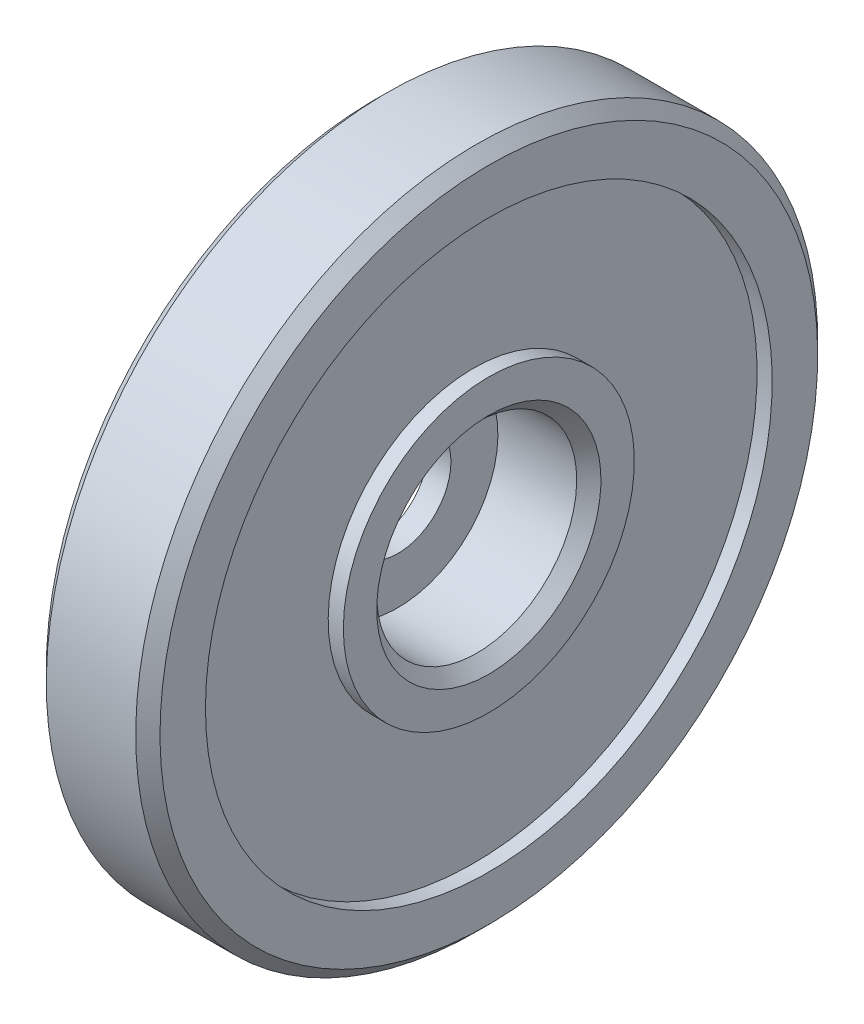
ISO-10303-21;
HEADER;
FILE_DESCRIPTION(('STEP AP214'),'2;1');
FILE_NAME('part.step','',(''),(''),'','','');
FILE_SCHEMA(('AUTOMOTIVE_DESIGN { 1 0 10303 214 1 1 1 1 }'));
ENDSEC;
DATA;
#1=APPLICATION_CONTEXT('core data for automotive mechanical design processes');
#2=APPLICATION_PROTOCOL_DEFINITION('international standard','automotive_design',2000,#1);
#3=PRODUCT_CONTEXT('',#1,'mechanical');
#4=PRODUCT('Part','Part','',(#3));
#5=PRODUCT_RELATED_PRODUCT_CATEGORY('part','',(#4));
#6=PRODUCT_DEFINITION_FORMATION('','',#4);
#7=PRODUCT_DEFINITION_CONTEXT('part definition',#1,'design');
#8=PRODUCT_DEFINITION('design','',#6,#7);
#9=PRODUCT_DEFINITION_SHAPE('','',#8);
#10=(LENGTH_UNIT() NAMED_UNIT(*) SI_UNIT(.MILLI.,.METRE.));
#11=(NAMED_UNIT(*) PLANE_ANGLE_UNIT() SI_UNIT($,.RADIAN.));
#12=(NAMED_UNIT(*) SI_UNIT($,.STERADIAN.) SOLID_ANGLE_UNIT());
#13=UNCERTAINTY_MEASURE_WITH_UNIT(LENGTH_MEASURE(1.E-05),#10,'distance_accuracy_value','');
#14=(GEOMETRIC_REPRESENTATION_CONTEXT(3) GLOBAL_UNCERTAINTY_ASSIGNED_CONTEXT((#13)) GLOBAL_UNIT_ASSIGNED_CONTEXT((#10,
#11,#12)) REPRESENTATION_CONTEXT('',''));
#15=CARTESIAN_POINT('',(0.,0.,0.));
#16=DIRECTION('',(0.,0.,1.));
#17=DIRECTION('',(1.,0.,0.));
#18=AXIS2_PLACEMENT_3D('',#15,#16,#17);
#19=CARTESIAN_POINT('',(120.899999999998,-26.570156009208,-29.4506874007701));
#20=DIRECTION('',(1.,0.,0.));
#21=DIRECTION('',(0.,0.999903298534947,0.013906601990886));
#22=AXIS2_PLACEMENT_3D('',#19,#20,#21);
#23=CONICAL_SURFACE('',#22,6.6,0.785398163397449);
#24=CARTESIAN_POINT('',(120.899999999998,-26.570156009208,-29.4506874007701));
#25=DIRECTION('',(1.,0.,0.));
#26=DIRECTION('',(0.,0.999903298534947,0.013906601990886));
#27=AXIS2_PLACEMENT_3D('',#24,#25,#26);
#28=CIRCLE('',#27,6.6);
#29=CARTESIAN_POINT('',(120.899999999998,-19.9707942388773,-29.3589038276302));
#30=VERTEX_POINT('',#29);
#31=EDGE_CURVE('E162',#30,#30,#28,.T.);
#32=ORIENTED_EDGE('',*,*,#31,.F.);
#33=EDGE_LOOP('',(#32));
#34=FACE_BOUND('',#33,.T.);
#35=CARTESIAN_POINT('',(121.699999999998,-26.570156009208,-29.4506874007701));
#36=DIRECTION('',(-1.,0.,0.));
#37=DIRECTION('',(0.,0.999903298534947,0.013906601990886));
#38=AXIS2_PLACEMENT_3D('',#35,#36,#37);
#39=CIRCLE('',#38,7.4);
#40=CARTESIAN_POINT('',(121.699999999998,-19.1708716000494,-29.3477785460375));
#41=VERTEX_POINT('',#40);
#42=EDGE_CURVE('E152',#41,#41,#39,.T.);
#43=ORIENTED_EDGE('',*,*,#42,.F.);
#44=EDGE_LOOP('',(#43));
#45=FACE_BOUND('',#44,.T.);
#46=ADVANCED_FACE('F53',(#34,#45),#23,.F.);
#47=CARTESIAN_POINT('',(118.399999999998,-26.570156009208,-29.4506874007701));
#48=DIRECTION('',(-1.,0.,0.));
#49=DIRECTION('',(0.,0.999903298534947,0.013906601990886));
#50=AXIS2_PLACEMENT_3D('',#47,#48,#49);
#51=PLANE('',#50);
#52=CARTESIAN_POINT('',(118.399999999998,-26.7092220291169,-19.4516544154206));
#53=DIRECTION('',(-1.,0.,0.));
#54=DIRECTION('',(0.,-0.999903298534947,-0.013906601990886));
#55=AXIS2_PLACEMENT_3D('',#52,#53,#54);
#56=CIRCLE('',#55,1.15);
#57=CARTESIAN_POINT('',(118.399999999998,-27.8591108224321,-19.4676470077101));
#58=VERTEX_POINT('',#57);
#59=EDGE_CURVE('E11',#58,#58,#56,.T.);
#60=ORIENTED_EDGE('',*,*,#59,.T.);
#61=EDGE_LOOP('',(#60));
#62=FACE_BOUND('',#61,.T.);
#63=ADVANCED_FACE('F55',(#62),#51,.T.);
#64=CARTESIAN_POINT('',(118.399999999998,-26.7092220291169,-19.4516544154206));
#65=DIRECTION('',(-1.,0.,0.));
#66=DIRECTION('',(0.,-0.999903298534947,-0.013906601990886));
#67=AXIS2_PLACEMENT_3D('',#64,#65,#66);
#68=CYLINDRICAL_SURFACE('',#67,1.15);
#69=CARTESIAN_POINT('',(114.199999999998,-26.7092220291169,-19.4516544154206));
#70=DIRECTION('',(1.,0.,0.));
#71=DIRECTION('',(0.,0.999903298534947,0.013906601990886));
#72=AXIS2_PLACEMENT_3D('',#69,#70,#71);
#73=CIRCLE('',#72,1.15);
#74=CARTESIAN_POINT('',(114.199999999998,-25.5593332358017,-19.4356618231311));
#75=VERTEX_POINT('',#74);
#76=EDGE_CURVE('E173',#75,#75,#73,.T.);
#77=ORIENTED_EDGE('',*,*,#76,.F.);
#78=EDGE_LOOP('',(#77));
#79=FACE_BOUND('',#78,.T.);
#80=ORIENTED_EDGE('',*,*,#59,.F.);
#81=EDGE_LOOP('',(#80));
#82=FACE_BOUND('',#81,.T.);
#83=ADVANCED_FACE('F239',(#79,#82),#68,.F.);
#84=CARTESIAN_POINT('',(118.399999999998,-26.570156009208,-29.4506874007701));
#85=DIRECTION('',(-1.,0.,0.));
#86=DIRECTION('',(0.,0.999903298534947,0.013906601990886));
#87=AXIS2_PLACEMENT_3D('',#84,#85,#86);
#88=PLANE('',#87);
#89=CARTESIAN_POINT('',(118.399999999998,-17.8412064206624,-34.3297691874005));
#90=DIRECTION('',(-1.,0.,0.));
#91=DIRECTION('',(0.,-0.999903298534947,-0.013906601990886));
#92=AXIS2_PLACEMENT_3D('',#89,#90,#91);
#93=CIRCLE('',#92,1.15);
#94=CARTESIAN_POINT('',(118.399999999998,-18.9910952139776,-34.3457617796901));
#95=VERTEX_POINT('',#94);
#96=EDGE_CURVE('E62',#95,#95,#93,.T.);
#97=ORIENTED_EDGE('',*,*,#96,.T.);
#98=EDGE_LOOP('',(#97));
#99=FACE_BOUND('',#98,.T.);
#100=ADVANCED_FACE('F234',(#99),#88,.T.);
#101=CARTESIAN_POINT('',(118.399999999998,-17.8412064206624,-34.3297691874005));
#102=DIRECTION('',(-1.,0.,0.));
#103=DIRECTION('',(0.,-0.999903298534947,-0.013906601990886));
#104=AXIS2_PLACEMENT_3D('',#101,#102,#103);
#105=CYLINDRICAL_SURFACE('',#104,1.15);
#106=CARTESIAN_POINT('',(114.199999999998,-17.8412064206624,-34.3297691874005));
#107=DIRECTION('',(1.,0.,0.));
#108=DIRECTION('',(0.,0.999903298534947,0.013906601990886));
#109=AXIS2_PLACEMENT_3D('',#106,#107,#108);
#110=CIRCLE('',#109,1.15);
#111=CARTESIAN_POINT('',(114.199999999998,-16.6913176273472,-34.313776595111));
#112=VERTEX_POINT('',#111);
#113=EDGE_CURVE('E176',#112,#112,#110,.T.);
#114=ORIENTED_EDGE('',*,*,#113,.F.);
#115=EDGE_LOOP('',(#114));
#116=FACE_BOUND('',#115,.T.);
#117=ORIENTED_EDGE('',*,*,#96,.F.);
#118=EDGE_LOOP('',(#117));
#119=FACE_BOUND('',#118,.T.);
#120=ADVANCED_FACE('F238',(#116,#119),#105,.F.);
#121=CARTESIAN_POINT('',(118.399999999998,-26.570156009208,-29.4506874007701));
#122=DIRECTION('',(-1.,0.,0.));
#123=DIRECTION('',(0.,0.999903298534947,0.013906601990886));
#124=AXIS2_PLACEMENT_3D('',#121,#122,#123);
#125=PLANE('',#124);
#126=CARTESIAN_POINT('',(118.399999999998,-35.1600395778448,-34.5706385994891));
#127=DIRECTION('',(-1.,0.,0.));
#128=DIRECTION('',(0.,-0.999903298534947,-0.013906601990886));
#129=AXIS2_PLACEMENT_3D('',#126,#127,#128);
#130=CIRCLE('',#129,1.15);
#131=CARTESIAN_POINT('',(118.399999999998,-36.30992837116,-34.5866311917786));
#132=VERTEX_POINT('',#131);
#133=EDGE_CURVE('E166',#132,#132,#130,.T.);
#134=ORIENTED_EDGE('',*,*,#133,.T.);
#135=EDGE_LOOP('',(#134));
#136=FACE_BOUND('',#135,.T.);
#137=ADVANCED_FACE('F334',(#136),#125,.T.);
#138=CARTESIAN_POINT('',(118.399999999998,-35.1600395778448,-34.5706385994891));
#139=DIRECTION('',(-1.,0.,0.));
#140=DIRECTION('',(0.,-0.999903298534947,-0.013906601990886));
#141=AXIS2_PLACEMENT_3D('',#138,#139,#140);
#142=CYLINDRICAL_SURFACE('',#141,1.15);
#143=CARTESIAN_POINT('',(114.199999999998,-35.1600395778448,-34.5706385994891));
#144=DIRECTION('',(1.,0.,0.));
#145=DIRECTION('',(0.,0.999903298534947,0.013906601990886));
#146=AXIS2_PLACEMENT_3D('',#143,#144,#145);
#147=CIRCLE('',#146,1.15);
#148=CARTESIAN_POINT('',(114.199999999998,-34.0101507845296,-34.5546460071995));
#149=VERTEX_POINT('',#148);
#150=EDGE_CURVE('E183',#149,#149,#147,.T.);
#151=ORIENTED_EDGE('',*,*,#150,.F.);
#152=EDGE_LOOP('',(#151));
#153=FACE_BOUND('',#152,.T.);
#154=ORIENTED_EDGE('',*,*,#133,.F.);
#155=EDGE_LOOP('',(#154));
#156=FACE_BOUND('',#155,.T.);
#157=ADVANCED_FACE('F325',(#153,#156),#142,.F.);
#158=CARTESIAN_POINT('',(120.699999999998,-26.570156009208,-29.4506874007701));
#159=DIRECTION('',(1.,0.,0.));
#160=DIRECTION('',(0.,-0.013906601990886,0.999903298534947));
#161=AXIS2_PLACEMENT_3D('',#158,#159,#160);
#162=PLANE('',#161);
#163=CARTESIAN_POINT('',(120.699999999998,-26.570156009208,-29.4506874007701));
#164=DIRECTION('',(1.,0.,0.));
#165=DIRECTION('',(0.,0.999903298534947,0.013906601990886));
#166=AXIS2_PLACEMENT_3D('',#163,#164,#165);
#167=CIRCLE('',#166,18.7);
#168=CARTESIAN_POINT('',(120.699999999998,-7.87196432660449,-29.1906339435405));
#169=VERTEX_POINT('',#168);
#170=EDGE_CURVE('E168',#169,#169,#167,.T.);
#171=ORIENTED_EDGE('',*,*,#170,.T.);
#172=EDGE_LOOP('',(#171));
#173=FACE_BOUND('',#172,.T.);
#174=CARTESIAN_POINT('',(120.699999999998,-26.570156009208,-29.4506874007701));
#175=DIRECTION('',(1.,0.,0.));
#176=DIRECTION('',(0.,0.999903298534947,0.013906601990886));
#177=AXIS2_PLACEMENT_3D('',#174,#175,#176);
#178=CIRCLE('',#177,9.6);
#179=CARTESIAN_POINT('',(120.699999999998,-16.9710843432725,-29.3171840216576));
#180=VERTEX_POINT('',#179);
#181=EDGE_CURVE('E197',#180,#180,#178,.T.);
#182=ORIENTED_EDGE('',*,*,#181,.F.);
#183=EDGE_LOOP('',(#182));
#184=FACE_BOUND('',#183,.T.);
#185=ADVANCED_FACE('F316',(#173,#184),#162,.T.);
#186=CARTESIAN_POINT('',(120.699999999998,-26.570156009208,-29.4506874007701));
#187=DIRECTION('',(1.,0.,0.));
#188=DIRECTION('',(0.,0.999903298534947,0.013906601990886));
#189=AXIS2_PLACEMENT_3D('',#186,#187,#188);
#190=CYLINDRICAL_SURFACE('',#189,18.7);
#191=CARTESIAN_POINT('',(121.699999999998,-26.570156009208,-29.4506874007701));
#192=DIRECTION('',(1.,0.,0.));
#193=DIRECTION('',(0.,0.999903298534947,0.013906601990886));
#194=AXIS2_PLACEMENT_3D('',#191,#192,#193);
#195=CIRCLE('',#194,18.7);
#196=CARTESIAN_POINT('',(121.699999999998,-7.87196432660449,-29.1906339435405));
#197=VERTEX_POINT('',#196);
#198=EDGE_CURVE('E186',#197,#197,#195,.T.);
#199=ORIENTED_EDGE('',*,*,#198,.T.);
#200=EDGE_LOOP('',(#199));
#201=FACE_BOUND('',#200,.T.);
#202=ORIENTED_EDGE('',*,*,#170,.F.);
#203=EDGE_LOOP('',(#202));
#204=FACE_BOUND('',#203,.T.);
#205=ADVANCED_FACE('F220',(#201,#204),#190,.F.);
#206=CARTESIAN_POINT('',(120.699999999998,-26.570156009208,-29.4506874007701));
#207=DIRECTION('',(1.,0.,0.));
#208=DIRECTION('',(0.,0.999903298534947,0.013906601990886));
#209=AXIS2_PLACEMENT_3D('',#206,#207,#208);
#210=CYLINDRICAL_SURFACE('',#209,9.6);
#211=CARTESIAN_POINT('',(121.699999999998,-26.570156009208,-29.4506874007701));
#212=DIRECTION('',(1.,0.,0.));
#213=DIRECTION('',(0.,0.999903298534947,0.013906601990886));
#214=AXIS2_PLACEMENT_3D('',#211,#212,#213);
#215=CIRCLE('',#214,9.6);
#216=CARTESIAN_POINT('',(121.699999999998,-16.9710843432725,-29.3171840216576));
#217=VERTEX_POINT('',#216);
#218=EDGE_CURVE('E146',#217,#217,#215,.T.);
#219=ORIENTED_EDGE('',*,*,#218,.F.);
#220=EDGE_LOOP('',(#219));
#221=FACE_BOUND('',#220,.T.);
#222=ORIENTED_EDGE('',*,*,#181,.T.);
#223=EDGE_LOOP('',(#222));
#224=FACE_BOUND('',#223,.T.);
#225=ADVANCED_FACE('F215',(#221,#224),#210,.T.);
#226=CARTESIAN_POINT('',(114.999999999998,-26.570156009208,-29.4506874007701));
#227=DIRECTION('',(1.,0.,0.));
#228=DIRECTION('',(0.,0.999903298534947,0.013906601990886));
#229=AXIS2_PLACEMENT_3D('',#226,#227,#228);
#230=CONICAL_SURFACE('',#229,22.5,0.785398163397448);
#231=CARTESIAN_POINT('',(114.999999999998,-26.570156009208,-29.4506874007701));
#232=DIRECTION('',(1.,0.,0.));
#233=DIRECTION('',(0.,0.999903298534947,0.013906601990886));
#234=AXIS2_PLACEMENT_3D('',#231,#232,#233);
#235=CIRCLE('',#234,22.5);
#236=CARTESIAN_POINT('',(114.999999999998,-4.07233179217169,-29.1377888559751));
#237=VERTEX_POINT('',#236);
#238=EDGE_CURVE('E180',#237,#237,#235,.T.);
#239=ORIENTED_EDGE('',*,*,#238,.F.);
#240=EDGE_LOOP('',(#239));
#241=FACE_BOUND('',#240,.T.);
#242=CARTESIAN_POINT('',(114.199999999998,-26.570156009208,-29.4506874007701));
#243=DIRECTION('',(-1.,0.,0.));
#244=DIRECTION('',(0.,0.999903298534947,0.013906601990886));
#245=AXIS2_PLACEMENT_3D('',#242,#243,#244);
#246=CIRCLE('',#245,21.7);
#247=CARTESIAN_POINT('',(114.199999999998,-4.87225443099965,-29.1489141375678));
#248=VERTEX_POINT('',#247);
#249=EDGE_CURVE('E164',#248,#248,#246,.T.);
#250=ORIENTED_EDGE('',*,*,#249,.F.);
#251=EDGE_LOOP('',(#250));
#252=FACE_BOUND('',#251,.T.);
#253=ADVANCED_FACE('F219',(#241,#252),#230,.T.);
#254=CARTESIAN_POINT('',(121.699999999998,-26.570156009208,-29.4506874007701));
#255=DIRECTION('',(-1.,0.,0.));
#256=DIRECTION('',(0.,-0.999903298534947,-0.013906601990886));
#257=AXIS2_PLACEMENT_3D('',#254,#255,#256);
#258=CONICAL_SURFACE('',#257,21.7,0.785398163397448);
#259=CARTESIAN_POINT('',(121.699999999998,-26.570156009208,-29.4506874007701));
#260=DIRECTION('',(1.,0.,0.));
#261=DIRECTION('',(0.,0.999903298534947,0.013906601990886));
#262=AXIS2_PLACEMENT_3D('',#259,#260,#261);
#263=CIRCLE('',#262,21.7);
#264=CARTESIAN_POINT('',(121.699999999998,-4.87225443099965,-29.1489141375678));
#265=VERTEX_POINT('',#264);
#266=EDGE_CURVE('E177',#265,#265,#263,.T.);
#267=ORIENTED_EDGE('',*,*,#266,.F.);
#268=EDGE_LOOP('',(#267));
#269=FACE_BOUND('',#268,.T.);
#270=CARTESIAN_POINT('',(120.899999999998,-26.570156009208,-29.4506874007701));
#271=DIRECTION('',(-1.,0.,0.));
#272=DIRECTION('',(0.,0.999903298534947,0.013906601990886));
#273=AXIS2_PLACEMENT_3D('',#270,#271,#272);
#274=CIRCLE('',#273,22.5);
#275=CARTESIAN_POINT('',(120.899999999998,-4.07233179217169,-29.1377888559751));
#276=VERTEX_POINT('',#275);
#277=EDGE_CURVE('E172',#276,#276,#274,.T.);
#278=ORIENTED_EDGE('',*,*,#277,.F.);
#279=EDGE_LOOP('',(#278));
#280=FACE_BOUND('',#279,.T.);
#281=ADVANCED_FACE('F283',(#269,#280),#258,.T.);
#282=CARTESIAN_POINT('',(115.699999999998,-26.570156009208,-29.4506874007701));
#283=DIRECTION('',(1.,0.,0.));
#284=DIRECTION('',(0.,-0.013906601990886,0.999903298534947));
#285=AXIS2_PLACEMENT_3D('',#282,#283,#284);
#286=PLANE('',#285);
#287=CARTESIAN_POINT('',(115.699999999998,-26.570156009208,-29.4506874007701));
#288=DIRECTION('',(1.,0.,0.));
#289=DIRECTION('',(0.,0.999903298534947,0.013906601990886));
#290=AXIS2_PLACEMENT_3D('',#287,#288,#289);
#291=CIRCLE('',#290,6.6);
#292=CARTESIAN_POINT('',(115.699999999998,-19.9707942388773,-29.3589038276302));
#293=VERTEX_POINT('',#292);
#294=EDGE_CURVE('E163',#293,#293,#291,.T.);
#295=ORIENTED_EDGE('',*,*,#294,.T.);
#296=EDGE_LOOP('',(#295));
#297=FACE_BOUND('',#296,.T.);
#298=CARTESIAN_POINT('',(115.699999999998,-26.570156009208,-29.4506874007701));
#299=DIRECTION('',(1.,0.,0.));
#300=DIRECTION('',(0.,0.999903298534947,0.013906601990886));
#301=AXIS2_PLACEMENT_3D('',#298,#299,#300);
#302=CIRCLE('',#301,3.5);
#303=CARTESIAN_POINT('',(115.699999999998,-23.0704944643357,-29.402014293802));
#304=VERTEX_POINT('',#303);
#305=EDGE_CURVE('E157',#304,#304,#302,.T.);
#306=ORIENTED_EDGE('',*,*,#305,.F.);
#307=EDGE_LOOP('',(#306));
#308=FACE_BOUND('',#307,.T.);
#309=ADVANCED_FACE('F249',(#297,#308),#286,.T.);
#310=CARTESIAN_POINT('',(115.699999999998,-26.570156009208,-29.4506874007701));
#311=DIRECTION('',(1.,0.,0.));
#312=DIRECTION('',(0.,0.999903298534947,0.013906601990886));
#313=AXIS2_PLACEMENT_3D('',#310,#311,#312);
#314=CYLINDRICAL_SURFACE('',#313,6.6);
#315=ORIENTED_EDGE('',*,*,#294,.F.);
#316=EDGE_LOOP('',(#315));
#317=FACE_BOUND('',#316,.T.);
#318=ORIENTED_EDGE('',*,*,#31,.T.);
#319=EDGE_LOOP('',(#318));
#320=FACE_BOUND('',#319,.T.);
#321=ADVANCED_FACE('F244',(#317,#320),#314,.F.);
#322=CARTESIAN_POINT('',(114.199999999998,-26.570156009208,-29.4506874007701));
#323=DIRECTION('',(1.,0.,0.));
#324=DIRECTION('',(0.,-0.013906601990886,0.999903298534947));
#325=AXIS2_PLACEMENT_3D('',#322,#323,#324);
#326=PLANE('',#325);
#327=CARTESIAN_POINT('',(114.199999999998,-26.570156009208,-29.4506874007701));
#328=DIRECTION('',(1.,0.,0.));
#329=DIRECTION('',(0.,0.999903298534947,0.013906601990886));
#330=AXIS2_PLACEMENT_3D('',#327,#328,#329);
#331=CIRCLE('',#330,3.5);
#332=CARTESIAN_POINT('',(114.199999999998,-23.0704944643357,-29.4020142938019));
#333=VERTEX_POINT('',#332);
#334=EDGE_CURVE('E151',#333,#333,#331,.T.);
#335=ORIENTED_EDGE('',*,*,#334,.T.);
#336=EDGE_LOOP('',(#335));
#337=FACE_BOUND('',#336,.T.);
#338=ORIENTED_EDGE('',*,*,#249,.T.);
#339=EDGE_LOOP('',(#338));
#340=FACE_BOUND('',#339,.T.);
#341=ORIENTED_EDGE('',*,*,#150,.T.);
#342=EDGE_LOOP('',(#341));
#343=FACE_BOUND('',#342,.T.);
#344=ORIENTED_EDGE('',*,*,#113,.T.);
#345=EDGE_LOOP('',(#344));
#346=FACE_BOUND('',#345,.T.);
#347=ORIENTED_EDGE('',*,*,#76,.T.);
#348=EDGE_LOOP('',(#347));
#349=FACE_BOUND('',#348,.T.);
#350=ADVANCED_FACE('F248',(#337,#340,#343,#346,#349),#326,.F.);
#351=CARTESIAN_POINT('',(121.699999999998,-26.570156009208,-29.4506874007701));
#352=DIRECTION('',(1.,0.,0.));
#353=DIRECTION('',(0.,-0.013906601990886,0.999903298534947));
#354=AXIS2_PLACEMENT_3D('',#351,#352,#353);
#355=PLANE('',#354);
#356=ORIENTED_EDGE('',*,*,#266,.T.);
#357=EDGE_LOOP('',(#356));
#358=FACE_BOUND('',#357,.T.);
#359=ORIENTED_EDGE('',*,*,#198,.F.);
#360=EDGE_LOOP('',(#359));
#361=FACE_BOUND('',#360,.T.);
#362=ADVANCED_FACE('F258',(#358,#361),#355,.T.);
#363=CARTESIAN_POINT('',(121.699999999998,-26.570156009208,-29.4506874007701));
#364=DIRECTION('',(-1.,0.,0.));
#365=DIRECTION('',(0.,-0.999903298534947,-0.013906601990886));
#366=AXIS2_PLACEMENT_3D('',#363,#364,#365);
#367=CYLINDRICAL_SURFACE('',#366,22.5);
#368=ORIENTED_EDGE('',*,*,#238,.T.);
#369=EDGE_LOOP('',(#368));
#370=FACE_BOUND('',#369,.T.);
#371=ORIENTED_EDGE('',*,*,#277,.T.);
#372=EDGE_LOOP('',(#371));
#373=FACE_BOUND('',#372,.T.);
#374=ADVANCED_FACE('F228',(#370,#373),#367,.T.);
#375=CARTESIAN_POINT('',(121.699999999998,-26.570156009208,-29.4506874007701));
#376=DIRECTION('',(-1.,0.,0.));
#377=DIRECTION('',(0.,-0.999903298534947,-0.013906601990886));
#378=AXIS2_PLACEMENT_3D('',#375,#376,#377);
#379=CYLINDRICAL_SURFACE('',#378,3.5);
#380=ORIENTED_EDGE('',*,*,#305,.T.);
#381=EDGE_LOOP('',(#380));
#382=FACE_BOUND('',#381,.T.);
#383=ORIENTED_EDGE('',*,*,#334,.F.);
#384=EDGE_LOOP('',(#383));
#385=FACE_BOUND('',#384,.T.);
#386=ADVANCED_FACE('F210',(#382,#385),#379,.F.);
#387=CARTESIAN_POINT('',(121.699999999998,-26.570156009208,-29.4506874007701));
#388=DIRECTION('',(1.,0.,0.));
#389=DIRECTION('',(0.,-0.013906601990886,0.999903298534947));
#390=AXIS2_PLACEMENT_3D('',#387,#388,#389);
#391=PLANE('',#390);
#392=ORIENTED_EDGE('',*,*,#218,.T.);
#393=EDGE_LOOP('',(#392));
#394=FACE_BOUND('',#393,.T.);
#395=ORIENTED_EDGE('',*,*,#42,.T.);
#396=EDGE_LOOP('',(#395));
#397=FACE_BOUND('',#396,.T.);
#398=ADVANCED_FACE('F147',(#394,#397),#391,.T.);
#399=CLOSED_SHELL('',(#46,#63,#83,#100,#120,#137,#157,#185,#205,#225,#253,#281,#309,#321,#350,
#362,#374,#386,#398));
#400=MANIFOLD_SOLID_BREP('B2',#399);
#401=ADVANCED_BREP_SHAPE_REPRESENTATION('',(#18,#400),#14);
#402=SHAPE_DEFINITION_REPRESENTATION(#9,#401);
ENDSEC;
END-ISO-10303-21;
